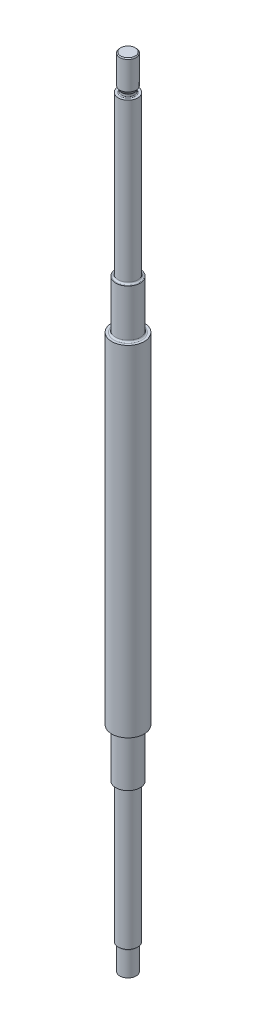
ISO-10303-21;
HEADER;
FILE_DESCRIPTION(('STEP AP214'),'2;1');
FILE_NAME('part.step','',(''),(''),'','','');
FILE_SCHEMA(('AUTOMOTIVE_DESIGN { 1 0 10303 214 1 1 1 1 }'));
ENDSEC;
DATA;
#1=APPLICATION_CONTEXT('core data for automotive mechanical design processes');
#2=APPLICATION_PROTOCOL_DEFINITION('international standard','automotive_design',2000,#1);
#3=PRODUCT_CONTEXT('',#1,'mechanical');
#4=PRODUCT('Part','Part','',(#3));
#5=PRODUCT_RELATED_PRODUCT_CATEGORY('part','',(#4));
#6=PRODUCT_DEFINITION_FORMATION('','',#4);
#7=PRODUCT_DEFINITION_CONTEXT('part definition',#1,'design');
#8=PRODUCT_DEFINITION('design','',#6,#7);
#9=PRODUCT_DEFINITION_SHAPE('','',#8);
#10=(LENGTH_UNIT() NAMED_UNIT(*) SI_UNIT(.MILLI.,.METRE.));
#11=(NAMED_UNIT(*) PLANE_ANGLE_UNIT() SI_UNIT($,.RADIAN.));
#12=(NAMED_UNIT(*) SI_UNIT($,.STERADIAN.) SOLID_ANGLE_UNIT());
#13=UNCERTAINTY_MEASURE_WITH_UNIT(LENGTH_MEASURE(1.E-05),#10,'distance_accuracy_value','');
#14=(GEOMETRIC_REPRESENTATION_CONTEXT(3) GLOBAL_UNCERTAINTY_ASSIGNED_CONTEXT((#13)) GLOBAL_UNIT_ASSIGNED_CONTEXT((#10,
#11,#12)) REPRESENTATION_CONTEXT('',''));
#15=CARTESIAN_POINT('',(0.,0.,0.));
#16=DIRECTION('',(0.,0.,1.));
#17=DIRECTION('',(1.,0.,0.));
#18=AXIS2_PLACEMENT_3D('',#15,#16,#17);
#19=CARTESIAN_POINT('',(0.,16.,0.));
#20=DIRECTION('',(0.,-1.,0.));
#21=DIRECTION('',(0.,0.,-1.));
#22=AXIS2_PLACEMENT_3D('',#19,#20,#21);
#23=CYLINDRICAL_SURFACE('',#22,5.);
#24=CARTESIAN_POINT('',(0.,15.,0.));
#25=DIRECTION('',(0.,1.,0.));
#26=DIRECTION('',(0.,0.,1.));
#27=AXIS2_PLACEMENT_3D('',#24,#25,#26);
#28=CIRCLE('',#27,5.);
#29=CARTESIAN_POINT('',(0.,15.,5.));
#30=VERTEX_POINT('',#29);
#31=EDGE_CURVE('E11',#30,#30,#28,.F.);
#32=ORIENTED_EDGE('',*,*,#31,.T.);
#33=EDGE_LOOP('',(#32));
#34=FACE_BOUND('',#33,.T.);
#35=CARTESIAN_POINT('',(0.,0.,0.));
#36=DIRECTION('',(0.,1.,0.));
#37=DIRECTION('',(0.,0.,1.));
#38=AXIS2_PLACEMENT_3D('',#35,#36,#37);
#39=CIRCLE('',#38,5.);
#40=CARTESIAN_POINT('',(-1.5,0.,-4.76969600708473));
#41=VERTEX_POINT('',#40);
#42=CARTESIAN_POINT('',(1.5,0.,-4.76969600708473));
#43=VERTEX_POINT('',#42);
#44=EDGE_CURVE('E175',#41,#43,#39,.T.);
#45=ORIENTED_EDGE('',*,*,#44,.T.);
#46=DIRECTION('',(0.,-1.,0.));
#47=VECTOR('',#46,1.);
#48=CARTESIAN_POINT('',(1.5,16.,-4.76969600708473));
#49=LINE('',#48,#47);
#50=CARTESIAN_POINT('',(1.5,11.,-4.76969600708473));
#51=VERTEX_POINT('',#50);
#52=EDGE_CURVE('E70',#43,#51,#49,.F.);
#53=ORIENTED_EDGE('',*,*,#52,.T.);
#54=CARTESIAN_POINT('',(1.5,11.,-4.76969600708473));
#55=CARTESIAN_POINT('',(1.50000085357071,11.041179392908,-4.76969249084934));
#56=CARTESIAN_POINT('',(1.49830317083428,11.0823380431261,-4.77022997000129));
#57=CARTESIAN_POINT('',(1.49153785660317,11.1643411620956,-4.77235095109999));
#58=CARTESIAN_POINT('',(1.48647098275841,11.2051856993949,-4.77393421787376));
#59=CARTESIAN_POINT('',(1.46630203689311,11.3265905409547,-4.78018490618873));
#60=CARTESIAN_POINT('',(1.44623120413663,11.4063063904164,-4.78635370384275));
#61=CARTESIAN_POINT('',(1.39353102315626,11.5610355783859,-4.80195952113208));
#62=CARTESIAN_POINT('',(1.36090607068203,11.6360505521981,-4.81139539670393));
#63=CARTESIAN_POINT('',(1.28407841117656,11.7795966815976,-4.83246571212052));
#64=CARTESIAN_POINT('',(1.23987031651226,11.8481247997284,-4.84410117434933));
#65=CARTESIAN_POINT('',(1.13964850658326,11.978866055997,-4.86866835244721));
#66=CARTESIAN_POINT('',(1.08333433465209,12.0408436603434,-4.88162755412974));
#67=CARTESIAN_POINT('',(0.961138919873356,12.1546355839,-4.90714811559049));
#68=CARTESIAN_POINT('',(0.89525606391635,12.206448186003,-4.91970940785249));
#69=CARTESIAN_POINT('',(0.754109921315432,12.2994637703185,-4.94333239727705));
#70=CARTESIAN_POINT('',(0.678680819336261,12.3404251802979,-4.95435770971354));
#71=CARTESIAN_POINT('',(0.521621185505776,12.4089884116181,-4.97334469846208));
#72=CARTESIAN_POINT('',(0.43999225901293,12.4365936777943,-4.98130716463903));
#73=CARTESIAN_POINT('',(0.275324697874881,12.476879799102,-4.99307639935002));
#74=CARTESIAN_POINT('',(0.192393125294256,12.4899648579697,-4.99699549276993));
#75=CARTESIAN_POINT('',(0.0254235719980843,12.5021173413633,-5.00063202022426));
#76=CARTESIAN_POINT('',(-0.0586141962423601,12.5011874197002,-5.00035024971471));
#77=CARTESIAN_POINT('',(-0.222571599946014,12.485607091241,-4.99569602566267));
#78=CARTESIAN_POINT('',(-0.302537145464638,12.4713946550213,-4.99145415509187));
#79=CARTESIAN_POINT('',(-0.458890052102023,12.4303683647619,-4.9795151369998));
#80=CARTESIAN_POINT('',(-0.535277225531995,12.4035538505441,-4.97181780846028));
#81=CARTESIAN_POINT('',(-0.683347815892214,12.3377877783536,-4.95365214926145));
#82=CARTESIAN_POINT('',(-0.75496600604414,12.2986983556431,-4.94315255692525));
#83=CARTESIAN_POINT('',(-0.890765529574418,12.2096014099517,-4.92049624651755));
#84=CARTESIAN_POINT('',(-0.954945191614592,12.1595914405212,-4.90833915735884));
#85=CARTESIAN_POINT('',(-1.07665450541275,12.0478080119165,-4.88311673571409));
#86=CARTESIAN_POINT('',(-1.13383351478034,11.9856561362393,-4.87003445449554));
#87=CARTESIAN_POINT('',(-1.23706769492487,11.8525025765721,-4.84484215114658));
#88=CARTESIAN_POINT('',(-1.28311962013077,11.7814983196345,-4.83273241337565));
#89=CARTESIAN_POINT('',(-1.36316407240863,11.6317190715507,-4.81077228795653));
#90=CARTESIAN_POINT('',(-1.39703006341134,11.5528728204066,-4.80094596245948));
#91=CARTESIAN_POINT('',(-1.45085886004699,11.3902754960183,-4.78495663653201));
#92=CARTESIAN_POINT('',(-1.47084293218035,11.3065321392856,-4.77878803475875));
#93=CARTESIAN_POINT('',(-1.48901203590079,11.1850051109298,-4.77314032325006));
#94=CARTESIAN_POINT('',(-1.49313202989008,11.1481092658204,-4.77185156275267));
#95=CARTESIAN_POINT('',(-1.49862355614854,11.0741485209005,-4.77012928611782));
#96=CARTESIAN_POINT('',(-1.49999912968268,11.0370839503361,-4.76969451246644));
#97=CARTESIAN_POINT('',(-1.5,11.,-4.76969600708473));
#98=B_SPLINE_CURVE_WITH_KNOTS('',3,(#54,#55,#56,#57,#58,#59,#60,#61,#62,#63,#64,#65,#66,#67,#68,
#69,#70,#71,#72,#73,#74,#75,#76,#77,#78,#79,#80,#81,#82,#83,#84,#85,#86,#87,#88,#89,#90,#91,#92,
#93,#94,#95,#96,#97),.UNSPECIFIED.,.F.,.F.,(4,2,2,2,2,2,2,2,2,2,2,2,2,2,2,2,2,2,2,2,2,4),(0.,
0.123459071219734,0.246890388853042,0.49291134961521,0.738846245884321,0.984895736828092,
1.23795510798803,1.49105719006936,1.74939356197455,2.00766326783256,2.25854751319802,
2.5093842528947,2.75223130012966,2.99509107067835,3.2407824256273,3.48652887757005,
3.74172568310981,3.99699683536777,4.25484698071527,4.51230123440207,4.62365084745808,
4.73483637253615),.UNSPECIFIED.);
#99=CARTESIAN_POINT('',(-1.5,11.,-4.76969600708473));
#100=VERTEX_POINT('',#99);
#101=EDGE_CURVE('E187',#51,#100,#98,.T.);
#102=ORIENTED_EDGE('',*,*,#101,.T.);
#103=DIRECTION('',(0.,-1.,0.));
#104=VECTOR('',#103,1.);
#105=CARTESIAN_POINT('',(-1.5,16.,-4.76969600708473));
#106=LINE('',#105,#104);
#107=EDGE_CURVE('E97',#100,#41,#106,.T.);
#108=ORIENTED_EDGE('',*,*,#107,.T.);
#109=EDGE_LOOP('',(#45,#53,#102,#108));
#110=FACE_BOUND('',#109,.T.);
#111=ADVANCED_FACE('F47',(#34,#110),#23,.T.);
#112=CARTESIAN_POINT('',(0.,0.,0.));
#113=DIRECTION('',(0.,1.,0.));
#114=DIRECTION('',(0.,0.,1.));
#115=AXIS2_PLACEMENT_3D('',#112,#113,#114);
#116=PLANE('',#115);
#117=DIRECTION('',(-1.,0.,0.));
#118=VECTOR('',#117,1.);
#119=CARTESIAN_POINT('',(0.,0.,-3.2));
#120=LINE('',#119,#118);
#121=CARTESIAN_POINT('',(1.5,0.,-3.2));
#122=VERTEX_POINT('',#121);
#123=CARTESIAN_POINT('',(-1.5,0.,-3.2));
#124=VERTEX_POINT('',#123);
#125=EDGE_CURVE('E107',#122,#124,#120,.T.);
#126=ORIENTED_EDGE('',*,*,#125,.F.);
#127=DIRECTION('',(0.,0.,-1.));
#128=VECTOR('',#127,1.);
#129=CARTESIAN_POINT('',(1.5,0.,0.));
#130=LINE('',#129,#128);
#131=EDGE_CURVE('E184',#122,#43,#130,.T.);
#132=ORIENTED_EDGE('',*,*,#131,.T.);
#133=ORIENTED_EDGE('',*,*,#44,.F.);
#134=DIRECTION('',(0.,0.,1.));
#135=VECTOR('',#134,1.);
#136=CARTESIAN_POINT('',(-1.5,0.,0.));
#137=LINE('',#136,#135);
#138=EDGE_CURVE('E181',#41,#124,#137,.T.);
#139=ORIENTED_EDGE('',*,*,#138,.T.);
#140=EDGE_LOOP('',(#126,#132,#133,#139));
#141=FACE_BOUND('',#140,.T.);
#142=ADVANCED_FACE('F273',(#141),#116,.F.);
#143=CARTESIAN_POINT('',(0.,102.,0.));
#144=DIRECTION('',(0.,-1.,0.));
#145=DIRECTION('',(0.,0.,-1.));
#146=AXIS2_PLACEMENT_3D('',#143,#144,#145);
#147=CYLINDRICAL_SURFACE('',#146,6.);
#148=CARTESIAN_POINT('',(0.,101.,0.));
#149=DIRECTION('',(0.,1.,0.));
#150=DIRECTION('',(0.,0.,1.));
#151=AXIS2_PLACEMENT_3D('',#148,#149,#150);
#152=CIRCLE('',#151,6.);
#153=CARTESIAN_POINT('',(0.,101.,6.));
#154=VERTEX_POINT('',#153);
#155=EDGE_CURVE('E56',#154,#154,#152,.F.);
#156=ORIENTED_EDGE('',*,*,#155,.T.);
#157=EDGE_LOOP('',(#156));
#158=FACE_BOUND('',#157,.T.);
#159=CARTESIAN_POINT('',(0.,16.,0.));
#160=DIRECTION('',(0.,1.,0.));
#161=DIRECTION('',(0.,0.,1.));
#162=AXIS2_PLACEMENT_3D('',#159,#160,#161);
#163=CIRCLE('',#162,6.);
#164=CARTESIAN_POINT('',(0.,16.,6.));
#165=VERTEX_POINT('',#164);
#166=EDGE_CURVE('E171',#165,#165,#163,.T.);
#167=ORIENTED_EDGE('',*,*,#166,.T.);
#168=EDGE_LOOP('',(#167));
#169=FACE_BOUND('',#168,.T.);
#170=ADVANCED_FACE('F270',(#158,#169),#147,.T.);
#171=CARTESIAN_POINT('',(0.,132.,0.));
#172=DIRECTION('',(0.,-1.,0.));
#173=DIRECTION('',(0.,0.,-1.));
#174=AXIS2_PLACEMENT_3D('',#171,#172,#173);
#175=CYLINDRICAL_SURFACE('',#174,7.5);
#176=CARTESIAN_POINT('',(0.,131.,0.));
#177=DIRECTION('',(0.,1.,0.));
#178=DIRECTION('',(0.,0.,1.));
#179=AXIS2_PLACEMENT_3D('',#176,#177,#178);
#180=CIRCLE('',#179,7.5);
#181=CARTESIAN_POINT('',(0.,131.,7.5));
#182=VERTEX_POINT('',#181);
#183=EDGE_CURVE('E320',#182,#182,#180,.F.);
#184=ORIENTED_EDGE('',*,*,#183,.T.);
#185=EDGE_LOOP('',(#184));
#186=FACE_BOUND('',#185,.T.);
#187=CARTESIAN_POINT('',(0.,102.,0.));
#188=DIRECTION('',(0.,1.,0.));
#189=DIRECTION('',(0.,0.,1.));
#190=AXIS2_PLACEMENT_3D('',#187,#188,#189);
#191=CIRCLE('',#190,7.5);
#192=CARTESIAN_POINT('',(0.,102.,7.5));
#193=VERTEX_POINT('',#192);
#194=EDGE_CURVE('E164',#193,#193,#191,.T.);
#195=ORIENTED_EDGE('',*,*,#194,.T.);
#196=EDGE_LOOP('',(#195));
#197=FACE_BOUND('',#196,.T.);
#198=ADVANCED_FACE('F266',(#186,#197),#175,.T.);
#199=CARTESIAN_POINT('',(0.,102.,0.));
#200=DIRECTION('',(0.,1.,0.));
#201=DIRECTION('',(0.,0.,1.));
#202=AXIS2_PLACEMENT_3D('',#199,#200,#201);
#203=PLANE('',#202);
#204=CARTESIAN_POINT('',(0.,102.,0.));
#205=DIRECTION('',(0.,1.,0.));
#206=DIRECTION('',(0.,0.,1.));
#207=AXIS2_PLACEMENT_3D('',#204,#205,#206);
#208=CIRCLE('',#207,7.);
#209=CARTESIAN_POINT('',(0.,102.,7.));
#210=VERTEX_POINT('',#209);
#211=EDGE_CURVE('E318',#210,#210,#208,.T.);
#212=ORIENTED_EDGE('',*,*,#211,.T.);
#213=EDGE_LOOP('',(#212));
#214=FACE_BOUND('',#213,.T.);
#215=ORIENTED_EDGE('',*,*,#194,.F.);
#216=EDGE_LOOP('',(#215));
#217=FACE_BOUND('',#216,.T.);
#218=ADVANCED_FACE('F262',(#214,#217),#203,.F.);
#219=CARTESIAN_POINT('',(0.,342.,0.));
#220=DIRECTION('',(0.,-1.,0.));
#221=DIRECTION('',(0.,0.,-1.));
#222=AXIS2_PLACEMENT_3D('',#219,#220,#221);
#223=CYLINDRICAL_SURFACE('',#222,10.);
#224=CARTESIAN_POINT('',(0.,342.,0.));
#225=DIRECTION('',(0.,1.,0.));
#226=DIRECTION('',(0.,0.,1.));
#227=AXIS2_PLACEMENT_3D('',#224,#225,#226);
#228=CIRCLE('',#227,10.);
#229=CARTESIAN_POINT('',(0.,342.,10.));
#230=VERTEX_POINT('',#229);
#231=EDGE_CURVE('E160',#230,#230,#228,.T.);
#232=ORIENTED_EDGE('',*,*,#231,.F.);
#233=EDGE_LOOP('',(#232));
#234=FACE_BOUND('',#233,.T.);
#235=CARTESIAN_POINT('',(0.,132.,0.));
#236=DIRECTION('',(0.,1.,0.));
#237=DIRECTION('',(0.,0.,1.));
#238=AXIS2_PLACEMENT_3D('',#235,#236,#237);
#239=CIRCLE('',#238,10.);
#240=CARTESIAN_POINT('',(0.,132.,10.));
#241=VERTEX_POINT('',#240);
#242=EDGE_CURVE('E159',#241,#241,#239,.T.);
#243=ORIENTED_EDGE('',*,*,#242,.T.);
#244=EDGE_LOOP('',(#243));
#245=FACE_BOUND('',#244,.T.);
#246=ADVANCED_FACE('F255',(#234,#245),#223,.T.);
#247=CARTESIAN_POINT('',(0.,342.,0.));
#248=DIRECTION('',(0.,1.,0.));
#249=DIRECTION('',(0.,0.,1.));
#250=AXIS2_PLACEMENT_3D('',#247,#248,#249);
#251=PLANE('',#250);
#252=CARTESIAN_POINT('',(0.,342.,0.));
#253=DIRECTION('',(0.,1.,0.));
#254=DIRECTION('',(0.,0.,1.));
#255=AXIS2_PLACEMENT_3D('',#252,#253,#254);
#256=CIRCLE('',#255,8.5);
#257=CARTESIAN_POINT('',(0.,342.,8.5));
#258=VERTEX_POINT('',#257);
#259=EDGE_CURVE('E332',#258,#258,#256,.F.);
#260=ORIENTED_EDGE('',*,*,#259,.T.);
#261=EDGE_LOOP('',(#260));
#262=FACE_BOUND('',#261,.T.);
#263=ORIENTED_EDGE('',*,*,#231,.T.);
#264=EDGE_LOOP('',(#263));
#265=FACE_BOUND('',#264,.T.);
#266=ADVANCED_FACE('F252',(#262,#265),#251,.T.);
#267=CARTESIAN_POINT('',(0.,132.,0.));
#268=DIRECTION('',(0.,1.,0.));
#269=DIRECTION('',(0.,0.,1.));
#270=AXIS2_PLACEMENT_3D('',#267,#268,#269);
#271=PLANE('',#270);
#272=CARTESIAN_POINT('',(0.,132.,0.));
#273=DIRECTION('',(0.,1.,0.));
#274=DIRECTION('',(0.,0.,1.));
#275=AXIS2_PLACEMENT_3D('',#272,#273,#274);
#276=CIRCLE('',#275,8.5);
#277=CARTESIAN_POINT('',(0.,132.,8.5));
#278=VERTEX_POINT('',#277);
#279=EDGE_CURVE('E326',#278,#278,#276,.T.);
#280=ORIENTED_EDGE('',*,*,#279,.T.);
#281=EDGE_LOOP('',(#280));
#282=FACE_BOUND('',#281,.T.);
#283=ORIENTED_EDGE('',*,*,#242,.F.);
#284=EDGE_LOOP('',(#283));
#285=FACE_BOUND('',#284,.T.);
#286=ADVANCED_FACE('F250',(#282,#285),#271,.F.);
#287=CARTESIAN_POINT('',(0.,372.,0.));
#288=DIRECTION('',(0.,-1.,0.));
#289=DIRECTION('',(0.,0.,-1.));
#290=AXIS2_PLACEMENT_3D('',#287,#288,#289);
#291=CYLINDRICAL_SURFACE('',#290,7.5);
#292=CARTESIAN_POINT('',(0.,343.,0.));
#293=DIRECTION('',(0.,1.,0.));
#294=DIRECTION('',(0.,0.,1.));
#295=AXIS2_PLACEMENT_3D('',#292,#293,#294);
#296=CIRCLE('',#295,7.5);
#297=CARTESIAN_POINT('',(0.,343.,7.5));
#298=VERTEX_POINT('',#297);
#299=EDGE_CURVE('E336',#298,#298,#296,.T.);
#300=ORIENTED_EDGE('',*,*,#299,.T.);
#301=EDGE_LOOP('',(#300));
#302=FACE_BOUND('',#301,.T.);
#303=CARTESIAN_POINT('',(0.,372.,0.));
#304=DIRECTION('',(0.,1.,0.));
#305=DIRECTION('',(0.,0.,1.));
#306=AXIS2_PLACEMENT_3D('',#303,#304,#305);
#307=CIRCLE('',#306,7.5);
#308=CARTESIAN_POINT('',(0.,372.,7.5));
#309=VERTEX_POINT('',#308);
#310=EDGE_CURVE('E155',#309,#309,#307,.T.);
#311=ORIENTED_EDGE('',*,*,#310,.F.);
#312=EDGE_LOOP('',(#311));
#313=FACE_BOUND('',#312,.T.);
#314=ADVANCED_FACE('F246',(#302,#313),#291,.T.);
#315=CARTESIAN_POINT('',(0.,372.,0.));
#316=DIRECTION('',(0.,1.,0.));
#317=DIRECTION('',(0.,0.,1.));
#318=AXIS2_PLACEMENT_3D('',#315,#316,#317);
#319=PLANE('',#318);
#320=CARTESIAN_POINT('',(0.,372.,0.));
#321=DIRECTION('',(0.,1.,0.));
#322=DIRECTION('',(0.,0.,1.));
#323=AXIS2_PLACEMENT_3D('',#320,#321,#322);
#324=CIRCLE('',#323,7.);
#325=CARTESIAN_POINT('',(0.,372.,7.));
#326=VERTEX_POINT('',#325);
#327=EDGE_CURVE('E339',#326,#326,#324,.F.);
#328=ORIENTED_EDGE('',*,*,#327,.T.);
#329=EDGE_LOOP('',(#328));
#330=FACE_BOUND('',#329,.T.);
#331=ORIENTED_EDGE('',*,*,#310,.T.);
#332=EDGE_LOOP('',(#331));
#333=FACE_BOUND('',#332,.T.);
#334=ADVANCED_FACE('F242',(#330,#333),#319,.T.);
#335=CARTESIAN_POINT('',(0.,467.,0.));
#336=DIRECTION('',(0.,-1.,0.));
#337=DIRECTION('',(0.,0.,-1.));
#338=AXIS2_PLACEMENT_3D('',#335,#336,#337);
#339=CYLINDRICAL_SURFACE('',#338,6.);
#340=CARTESIAN_POINT('',(0.,373.,0.));
#341=DIRECTION('',(0.,1.,0.));
#342=DIRECTION('',(0.,0.,1.));
#343=AXIS2_PLACEMENT_3D('',#340,#341,#342);
#344=CIRCLE('',#343,6.);
#345=CARTESIAN_POINT('',(0.,373.,6.));
#346=VERTEX_POINT('',#345);
#347=EDGE_CURVE('E196',#346,#346,#344,.T.);
#348=ORIENTED_EDGE('',*,*,#347,.T.);
#349=EDGE_LOOP('',(#348));
#350=FACE_BOUND('',#349,.T.);
#351=CARTESIAN_POINT('',(0.,470.383974596215,0.));
#352=DIRECTION('',(0.,-1.,0.));
#353=DIRECTION('',(0.,0.,-1.));
#354=AXIS2_PLACEMENT_3D('',#351,#352,#353);
#355=CIRCLE('',#354,6.);
#356=CARTESIAN_POINT('',(0.,470.383974596215,-6.));
#357=VERTEX_POINT('',#356);
#358=EDGE_CURVE('E131',#357,#357,#355,.T.);
#359=ORIENTED_EDGE('',*,*,#358,.T.);
#360=EDGE_LOOP('',(#359));
#361=FACE_BOUND('',#360,.T.);
#362=ADVANCED_FACE('F235',(#350,#361),#339,.T.);
#363=CARTESIAN_POINT('',(0.,492.,0.));
#364=DIRECTION('',(0.,-1.,0.));
#365=DIRECTION('',(0.,0.,-1.));
#366=AXIS2_PLACEMENT_3D('',#363,#364,#365);
#367=CYLINDRICAL_SURFACE('',#366,5.);
#368=CARTESIAN_POINT('',(0.,474.,0.));
#369=DIRECTION('',(0.,-1.,0.));
#370=DIRECTION('',(0.,0.,-1.));
#371=AXIS2_PLACEMENT_3D('',#368,#369,#370);
#372=CIRCLE('',#371,5.);
#373=CARTESIAN_POINT('',(0.,474.,-5.));
#374=VERTEX_POINT('',#373);
#375=EDGE_CURVE('E151',#374,#374,#372,.T.);
#376=ORIENTED_EDGE('',*,*,#375,.F.);
#377=EDGE_LOOP('',(#376));
#378=FACE_BOUND('',#377,.T.);
#379=CARTESIAN_POINT('',(0.,491.4455,0.));
#380=DIRECTION('',(0.,-1.,0.));
#381=DIRECTION('',(0.,0.,-1.));
#382=AXIS2_PLACEMENT_3D('',#379,#380,#381);
#383=CIRCLE('',#382,5.);
#384=CARTESIAN_POINT('',(0.,491.4455,-5.));
#385=VERTEX_POINT('',#384);
#386=EDGE_CURVE('E123',#385,#385,#383,.T.);
#387=ORIENTED_EDGE('',*,*,#386,.T.);
#388=EDGE_LOOP('',(#387));
#389=FACE_BOUND('',#388,.T.);
#390=ADVANCED_FACE('F231',(#378,#389),#367,.T.);
#391=CARTESIAN_POINT('',(0.,474.,0.));
#392=DIRECTION('',(0.,1.,0.));
#393=DIRECTION('',(0.,0.,1.));
#394=AXIS2_PLACEMENT_3D('',#391,#392,#393);
#395=CONICAL_SURFACE('',#394,5.,0.52359877559828);
#396=CARTESIAN_POINT('',(0.,472.383974596215,0.));
#397=DIRECTION('',(0.,-1.,0.));
#398=DIRECTION('',(0.,0.,-1.));
#399=AXIS2_PLACEMENT_3D('',#396,#397,#398);
#400=CIRCLE('',#399,4.06698729810777);
#401=CARTESIAN_POINT('',(0.,472.383974596215,-4.06698729810777));
#402=VERTEX_POINT('',#401);
#403=EDGE_CURVE('E147',#402,#402,#400,.T.);
#404=ORIENTED_EDGE('',*,*,#403,.F.);
#405=EDGE_LOOP('',(#404));
#406=FACE_BOUND('',#405,.T.);
#407=ORIENTED_EDGE('',*,*,#375,.T.);
#408=EDGE_LOOP('',(#407));
#409=FACE_BOUND('',#408,.T.);
#410=ADVANCED_FACE('F227',(#406,#409),#395,.T.);
#411=CARTESIAN_POINT('',(0.,472.133974596215,0.));
#412=DIRECTION('',(0.,-1.,0.));
#413=DIRECTION('',(0.,0.,-1.));
#414=AXIS2_PLACEMENT_3D('',#411,#412,#413);
#415=TOROIDAL_SURFACE('',#414,4.5,0.500000000000002);
#416=CARTESIAN_POINT('',(0.,472.133974596215,0.));
#417=DIRECTION('',(0.,-1.,0.));
#418=DIRECTION('',(0.,0.,-1.));
#419=AXIS2_PLACEMENT_3D('',#416,#417,#418);
#420=CIRCLE('',#419,4.);
#421=CARTESIAN_POINT('',(0.,472.133974596215,-4.));
#422=VERTEX_POINT('',#421);
#423=EDGE_CURVE('E143',#422,#422,#420,.T.);
#424=ORIENTED_EDGE('',*,*,#423,.F.);
#425=EDGE_LOOP('',(#424));
#426=FACE_BOUND('',#425,.T.);
#427=ORIENTED_EDGE('',*,*,#403,.T.);
#428=EDGE_LOOP('',(#427));
#429=FACE_BOUND('',#428,.T.);
#430=ADVANCED_FACE('F223',(#426,#429),#415,.F.);
#431=CARTESIAN_POINT('',(0.,492.,0.));
#432=DIRECTION('',(0.,-1.,0.));
#433=DIRECTION('',(0.,0.,-1.));
#434=AXIS2_PLACEMENT_3D('',#431,#432,#433);
#435=CYLINDRICAL_SURFACE('',#434,4.);
#436=CARTESIAN_POINT('',(0.,470.883974596215,0.));
#437=DIRECTION('',(0.,-1.,0.));
#438=DIRECTION('',(0.,0.,-1.));
#439=AXIS2_PLACEMENT_3D('',#436,#437,#438);
#440=CIRCLE('',#439,4.);
#441=CARTESIAN_POINT('',(0.,470.883974596215,-4.));
#442=VERTEX_POINT('',#441);
#443=EDGE_CURVE('E139',#442,#442,#440,.T.);
#444=ORIENTED_EDGE('',*,*,#443,.F.);
#445=EDGE_LOOP('',(#444));
#446=FACE_BOUND('',#445,.T.);
#447=ORIENTED_EDGE('',*,*,#423,.T.);
#448=EDGE_LOOP('',(#447));
#449=FACE_BOUND('',#448,.T.);
#450=ADVANCED_FACE('F219',(#446,#449),#435,.T.);
#451=CARTESIAN_POINT('',(0.,470.883974596215,0.));
#452=DIRECTION('',(0.,-1.,0.));
#453=DIRECTION('',(0.,0.,-1.));
#454=AXIS2_PLACEMENT_3D('',#451,#452,#453);
#455=TOROIDAL_SURFACE('',#454,4.5,0.5);
#456=CARTESIAN_POINT('',(0.,470.383974596215,0.));
#457=DIRECTION('',(0.,-1.,0.));
#458=DIRECTION('',(0.,0.,-1.));
#459=AXIS2_PLACEMENT_3D('',#456,#457,#458);
#460=CIRCLE('',#459,4.5);
#461=CARTESIAN_POINT('',(0.,470.383974596215,-4.5));
#462=VERTEX_POINT('',#461);
#463=EDGE_CURVE('E135',#462,#462,#460,.T.);
#464=ORIENTED_EDGE('',*,*,#463,.F.);
#465=EDGE_LOOP('',(#464));
#466=FACE_BOUND('',#465,.T.);
#467=ORIENTED_EDGE('',*,*,#443,.T.);
#468=EDGE_LOOP('',(#467));
#469=FACE_BOUND('',#468,.T.);
#470=ADVANCED_FACE('F215',(#466,#469),#455,.F.);
#471=CARTESIAN_POINT('',(4.5,470.383974596215,0.));
#472=DIRECTION('',(0.,-1.,0.));
#473=DIRECTION('',(0.,0.,-1.));
#474=AXIS2_PLACEMENT_3D('',#471,#472,#473);
#475=PLANE('',#474);
#476=ORIENTED_EDGE('',*,*,#358,.F.);
#477=EDGE_LOOP('',(#476));
#478=FACE_BOUND('',#477,.T.);
#479=ORIENTED_EDGE('',*,*,#463,.T.);
#480=EDGE_LOOP('',(#479));
#481=FACE_BOUND('',#480,.T.);
#482=ADVANCED_FACE('F211',(#478,#481),#475,.F.);
#483=CARTESIAN_POINT('',(0.,492.,0.));
#484=DIRECTION('',(0.,-1.,0.));
#485=DIRECTION('',(0.,0.,-1.));
#486=AXIS2_PLACEMENT_3D('',#483,#484,#485);
#487=CONICAL_SURFACE('',#486,4.4455,0.785398163397437);
#488=ORIENTED_EDGE('',*,*,#386,.F.);
#489=EDGE_LOOP('',(#488));
#490=FACE_BOUND('',#489,.T.);
#491=CARTESIAN_POINT('',(0.,492.,0.));
#492=DIRECTION('',(0.,-1.,0.));
#493=DIRECTION('',(0.,0.,-1.));
#494=AXIS2_PLACEMENT_3D('',#491,#492,#493);
#495=CIRCLE('',#494,4.4455);
#496=CARTESIAN_POINT('',(0.,492.,-4.4455));
#497=VERTEX_POINT('',#496);
#498=EDGE_CURVE('E127',#497,#497,#495,.T.);
#499=ORIENTED_EDGE('',*,*,#498,.T.);
#500=EDGE_LOOP('',(#499));
#501=FACE_BOUND('',#500,.T.);
#502=ADVANCED_FACE('F208',(#490,#501),#487,.T.);
#503=CARTESIAN_POINT('',(0.,492.,0.));
#504=DIRECTION('',(0.,1.,0.));
#505=DIRECTION('',(0.,0.,1.));
#506=AXIS2_PLACEMENT_3D('',#503,#504,#505);
#507=PLANE('',#506);
#508=ORIENTED_EDGE('',*,*,#498,.F.);
#509=EDGE_LOOP('',(#508));
#510=FACE_BOUND('',#509,.T.);
#511=ADVANCED_FACE('F206',(#510),#507,.T.);
#512=CARTESIAN_POINT('',(0.,11.,-10.));
#513=DIRECTION('',(0.,0.,1.));
#514=DIRECTION('',(1.,0.,0.));
#515=AXIS2_PLACEMENT_3D('',#512,#513,#514);
#516=CYLINDRICAL_SURFACE('',#515,1.5);
#517=DIRECTION('',(0.,0.,1.));
#518=VECTOR('',#517,1.);
#519=CARTESIAN_POINT('',(1.5,11.,-10.));
#520=LINE('',#519,#518);
#521=CARTESIAN_POINT('',(1.5,11.,-3.2));
#522=VERTEX_POINT('',#521);
#523=EDGE_CURVE('E102',#51,#522,#520,.T.);
#524=ORIENTED_EDGE('',*,*,#523,.T.);
#525=CARTESIAN_POINT('',(0.,11.,-3.2));
#526=DIRECTION('',(0.,0.,1.));
#527=DIRECTION('',(-1.,0.,0.));
#528=AXIS2_PLACEMENT_3D('',#525,#526,#527);
#529=CIRCLE('',#528,1.5);
#530=CARTESIAN_POINT('',(-1.5,11.,-3.2));
#531=VERTEX_POINT('',#530);
#532=EDGE_CURVE('E105',#522,#531,#529,.T.);
#533=ORIENTED_EDGE('',*,*,#532,.T.);
#534=DIRECTION('',(0.,0.,1.));
#535=VECTOR('',#534,1.);
#536=CARTESIAN_POINT('',(-1.5,11.,-10.));
#537=LINE('',#536,#535);
#538=EDGE_CURVE('E91',#100,#531,#537,.T.);
#539=ORIENTED_EDGE('',*,*,#538,.F.);
#540=ORIENTED_EDGE('',*,*,#101,.F.);
#541=EDGE_LOOP('',(#524,#533,#539,#540));
#542=FACE_BOUND('',#541,.T.);
#543=ADVANCED_FACE('F110',(#542),#516,.F.);
#544=CARTESIAN_POINT('',(1.5,-11.,-10.));
#545=DIRECTION('',(1.,0.,0.));
#546=DIRECTION('',(0.,1.,0.));
#547=AXIS2_PLACEMENT_3D('',#544,#545,#546);
#548=PLANE('',#547);
#549=ORIENTED_EDGE('',*,*,#131,.F.);
#550=DIRECTION('',(0.,1.,0.));
#551=VECTOR('',#550,1.);
#552=CARTESIAN_POINT('',(1.5,-11.,-3.2));
#553=LINE('',#552,#551);
#554=EDGE_CURVE('E63',#122,#522,#553,.T.);
#555=ORIENTED_EDGE('',*,*,#554,.T.);
#556=ORIENTED_EDGE('',*,*,#523,.F.);
#557=ORIENTED_EDGE('',*,*,#52,.F.);
#558=EDGE_LOOP('',(#549,#555,#556,#557));
#559=FACE_BOUND('',#558,.T.);
#560=ADVANCED_FACE('F205',(#559),#548,.F.);
#561=CARTESIAN_POINT('',(-1.5,-11.,-10.));
#562=DIRECTION('',(-1.,0.,0.));
#563=DIRECTION('',(0.,-1.,0.));
#564=AXIS2_PLACEMENT_3D('',#561,#562,#563);
#565=PLANE('',#564);
#566=ORIENTED_EDGE('',*,*,#538,.T.);
#567=DIRECTION('',(0.,-1.,0.));
#568=VECTOR('',#567,1.);
#569=CARTESIAN_POINT('',(-1.5,-11.,-3.2));
#570=LINE('',#569,#568);
#571=EDGE_CURVE('E94',#531,#124,#570,.T.);
#572=ORIENTED_EDGE('',*,*,#571,.T.);
#573=ORIENTED_EDGE('',*,*,#138,.F.);
#574=ORIENTED_EDGE('',*,*,#107,.F.);
#575=EDGE_LOOP('',(#566,#572,#573,#574));
#576=FACE_BOUND('',#575,.T.);
#577=ADVANCED_FACE('F93',(#576),#565,.F.);
#578=CARTESIAN_POINT('',(0.,11.,-3.2));
#579=DIRECTION('',(0.,0.,-1.));
#580=DIRECTION('',(-1.,0.,0.));
#581=AXIS2_PLACEMENT_3D('',#578,#579,#580);
#582=PLANE('',#581);
#583=ORIENTED_EDGE('',*,*,#125,.T.);
#584=ORIENTED_EDGE('',*,*,#571,.F.);
#585=ORIENTED_EDGE('',*,*,#532,.F.);
#586=ORIENTED_EDGE('',*,*,#554,.F.);
#587=EDGE_LOOP('',(#583,#584,#585,#586));
#588=FACE_BOUND('',#587,.T.);
#589=ADVANCED_FACE('F104',(#588),#582,.T.);
#590=CARTESIAN_POINT('',(0.,373.,0.));
#591=DIRECTION('',(0.,1.,0.));
#592=DIRECTION('',(0.,0.,1.));
#593=AXIS2_PLACEMENT_3D('',#590,#591,#592);
#594=TOROIDAL_SURFACE('',#593,7.,1.);
#595=ORIENTED_EDGE('',*,*,#327,.F.);
#596=EDGE_LOOP('',(#595));
#597=FACE_BOUND('',#596,.T.);
#598=ORIENTED_EDGE('',*,*,#347,.F.);
#599=EDGE_LOOP('',(#598));
#600=FACE_BOUND('',#599,.T.);
#601=ADVANCED_FACE('F289',(#597,#600),#594,.F.);
#602=CARTESIAN_POINT('',(0.,343.,0.));
#603=DIRECTION('',(0.,1.,0.));
#604=DIRECTION('',(0.,0.,1.));
#605=AXIS2_PLACEMENT_3D('',#602,#603,#604);
#606=TOROIDAL_SURFACE('',#605,8.5,1.);
#607=ORIENTED_EDGE('',*,*,#259,.F.);
#608=EDGE_LOOP('',(#607));
#609=FACE_BOUND('',#608,.T.);
#610=ORIENTED_EDGE('',*,*,#299,.F.);
#611=EDGE_LOOP('',(#610));
#612=FACE_BOUND('',#611,.T.);
#613=ADVANCED_FACE('F293',(#609,#612),#606,.F.);
#614=CARTESIAN_POINT('',(0.,131.,0.));
#615=DIRECTION('',(0.,1.,0.));
#616=DIRECTION('',(0.,0.,1.));
#617=AXIS2_PLACEMENT_3D('',#614,#615,#616);
#618=TOROIDAL_SURFACE('',#617,8.5,1.);
#619=ORIENTED_EDGE('',*,*,#183,.F.);
#620=EDGE_LOOP('',(#619));
#621=FACE_BOUND('',#620,.T.);
#622=ORIENTED_EDGE('',*,*,#279,.F.);
#623=EDGE_LOOP('',(#622));
#624=FACE_BOUND('',#623,.T.);
#625=ADVANCED_FACE('F298',(#621,#624),#618,.F.);
#626=CARTESIAN_POINT('',(0.,101.,0.));
#627=DIRECTION('',(0.,1.,0.));
#628=DIRECTION('',(0.,0.,1.));
#629=AXIS2_PLACEMENT_3D('',#626,#627,#628);
#630=TOROIDAL_SURFACE('',#629,7.,1.);
#631=ORIENTED_EDGE('',*,*,#155,.F.);
#632=EDGE_LOOP('',(#631));
#633=FACE_BOUND('',#632,.T.);
#634=ORIENTED_EDGE('',*,*,#211,.F.);
#635=EDGE_LOOP('',(#634));
#636=FACE_BOUND('',#635,.T.);
#637=ADVANCED_FACE('F305',(#633,#636),#630,.F.);
#638=CARTESIAN_POINT('',(0.,15.,0.));
#639=DIRECTION('',(0.,1.,0.));
#640=DIRECTION('',(0.,0.,1.));
#641=AXIS2_PLACEMENT_3D('',#638,#639,#640);
#642=TOROIDAL_SURFACE('',#641,6.,1.);
#643=ORIENTED_EDGE('',*,*,#31,.F.);
#644=EDGE_LOOP('',(#643));
#645=FACE_BOUND('',#644,.T.);
#646=ORIENTED_EDGE('',*,*,#166,.F.);
#647=EDGE_LOOP('',(#646));
#648=FACE_BOUND('',#647,.T.);
#649=ADVANCED_FACE('F49',(#645,#648),#642,.F.);
#650=CLOSED_SHELL('',(#111,#142,#170,#198,#218,#246,#266,#286,#314,#334,#362,#390,#410,#430,
#450,#470,#482,#502,#511,#543,#560,#577,#589,#601,#613,#625,#637,#649));
#651=MANIFOLD_SOLID_BREP('B2',#650);
#652=ADVANCED_BREP_SHAPE_REPRESENTATION('',(#18,#651),#14);
#653=SHAPE_DEFINITION_REPRESENTATION(#9,#652);
ENDSEC;
END-ISO-10303-21;
